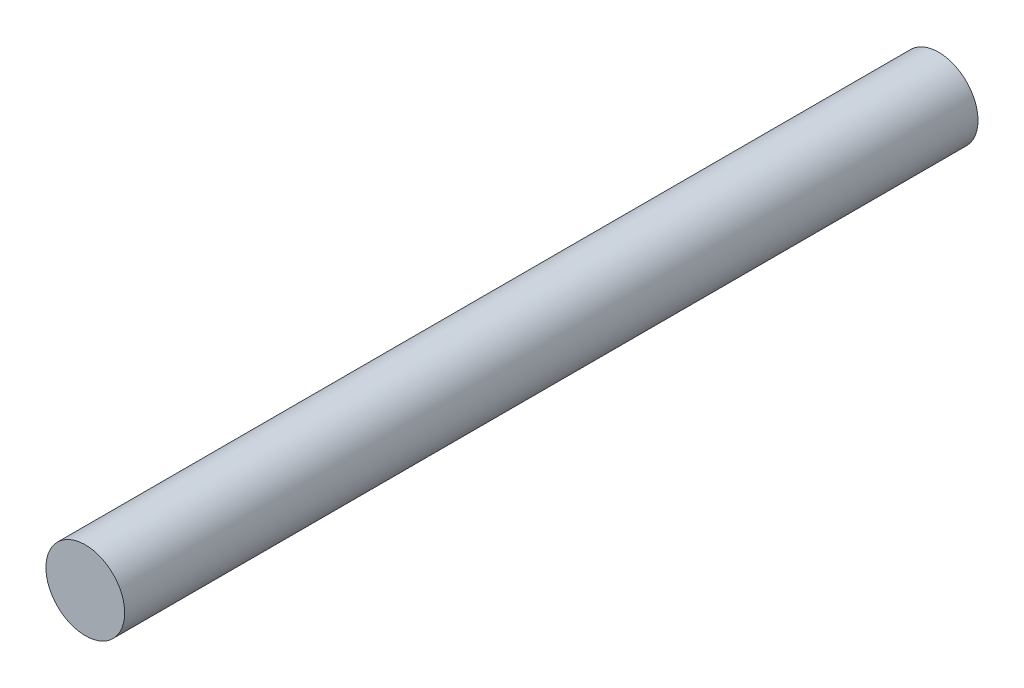
ISO-10303-21;
HEADER;
FILE_DESCRIPTION(('STEP AP214'),'2;1');
FILE_NAME('part.step','',(''),(''),'','','');
FILE_SCHEMA(('AUTOMOTIVE_DESIGN { 1 0 10303 214 1 1 1 1 }'));
ENDSEC;
DATA;
#1=APPLICATION_CONTEXT('core data for automotive mechanical design processes');
#2=APPLICATION_PROTOCOL_DEFINITION('international standard','automotive_design',2000,#1);
#3=PRODUCT_CONTEXT('',#1,'mechanical');
#4=PRODUCT('Part','Part','',(#3));
#5=PRODUCT_RELATED_PRODUCT_CATEGORY('part','',(#4));
#6=PRODUCT_DEFINITION_FORMATION('','',#4);
#7=PRODUCT_DEFINITION_CONTEXT('part definition',#1,'design');
#8=PRODUCT_DEFINITION('design','',#6,#7);
#9=PRODUCT_DEFINITION_SHAPE('','',#8);
#10=(LENGTH_UNIT() NAMED_UNIT(*) SI_UNIT(.MILLI.,.METRE.));
#11=(NAMED_UNIT(*) PLANE_ANGLE_UNIT() SI_UNIT($,.RADIAN.));
#12=(NAMED_UNIT(*) SI_UNIT($,.STERADIAN.) SOLID_ANGLE_UNIT());
#13=UNCERTAINTY_MEASURE_WITH_UNIT(LENGTH_MEASURE(1.E-05),#10,'distance_accuracy_value','');
#14=(GEOMETRIC_REPRESENTATION_CONTEXT(3) GLOBAL_UNCERTAINTY_ASSIGNED_CONTEXT((#13)) GLOBAL_UNIT_ASSIGNED_CONTEXT((#10,
#11,#12)) REPRESENTATION_CONTEXT('',''));
#15=CARTESIAN_POINT('',(0.,0.,0.));
#16=DIRECTION('',(0.,0.,1.));
#17=DIRECTION('',(1.,0.,0.));
#18=AXIS2_PLACEMENT_3D('',#15,#16,#17);
#19=CARTESIAN_POINT('',(0.,0.,16.25));
#20=DIRECTION('',(0.,0.,-1.));
#21=DIRECTION('',(-1.,0.,0.));
#22=AXIS2_PLACEMENT_3D('',#19,#20,#21);
#23=CYLINDRICAL_SURFACE('',#22,1.5);
#24=CARTESIAN_POINT('',(0.,0.,16.25));
#25=DIRECTION('',(0.,0.,1.));
#26=DIRECTION('',(1.,0.,0.));
#27=AXIS2_PLACEMENT_3D('',#24,#25,#26);
#28=CIRCLE('',#27,1.5);
#29=CARTESIAN_POINT('',(1.5,0.,16.25));
#30=VERTEX_POINT('',#29);
#31=EDGE_CURVE('E10',#30,#30,#28,.T.);
#32=ORIENTED_EDGE('',*,*,#31,.F.);
#33=EDGE_LOOP('',(#32));
#34=FACE_BOUND('',#33,.T.);
#35=CARTESIAN_POINT('',(0.,0.,-16.25));
#36=DIRECTION('',(0.,0.,1.));
#37=DIRECTION('',(1.,0.,0.));
#38=AXIS2_PLACEMENT_3D('',#35,#36,#37);
#39=CIRCLE('',#38,1.5);
#40=CARTESIAN_POINT('',(1.5,0.,-16.25));
#41=VERTEX_POINT('',#40);
#42=EDGE_CURVE('E36',#41,#41,#39,.T.);
#43=ORIENTED_EDGE('',*,*,#42,.T.);
#44=EDGE_LOOP('',(#43));
#45=FACE_BOUND('',#44,.T.);
#46=ADVANCED_FACE('F33',(#34,#45),#23,.T.);
#47=CARTESIAN_POINT('',(0.,0.,16.25));
#48=DIRECTION('',(0.,0.,1.));
#49=DIRECTION('',(1.,0.,0.));
#50=AXIS2_PLACEMENT_3D('',#47,#48,#49);
#51=PLANE('',#50);
#52=ORIENTED_EDGE('',*,*,#31,.T.);
#53=EDGE_LOOP('',(#52));
#54=FACE_BOUND('',#53,.T.);
#55=ADVANCED_FACE('F48',(#54),#51,.T.);
#56=CARTESIAN_POINT('',(0.,0.,-16.25));
#57=DIRECTION('',(0.,0.,1.));
#58=DIRECTION('',(1.,0.,0.));
#59=AXIS2_PLACEMENT_3D('',#56,#57,#58);
#60=PLANE('',#59);
#61=ORIENTED_EDGE('',*,*,#42,.F.);
#62=EDGE_LOOP('',(#61));
#63=FACE_BOUND('',#62,.T.);
#64=ADVANCED_FACE('F46',(#63),#60,.F.);
#65=CLOSED_SHELL('',(#46,#55,#64));
#66=MANIFOLD_SOLID_BREP('B2',#65);
#67=ADVANCED_BREP_SHAPE_REPRESENTATION('',(#18,#66),#14);
#68=SHAPE_DEFINITION_REPRESENTATION(#9,#67);
ENDSEC;
END-ISO-10303-21;
